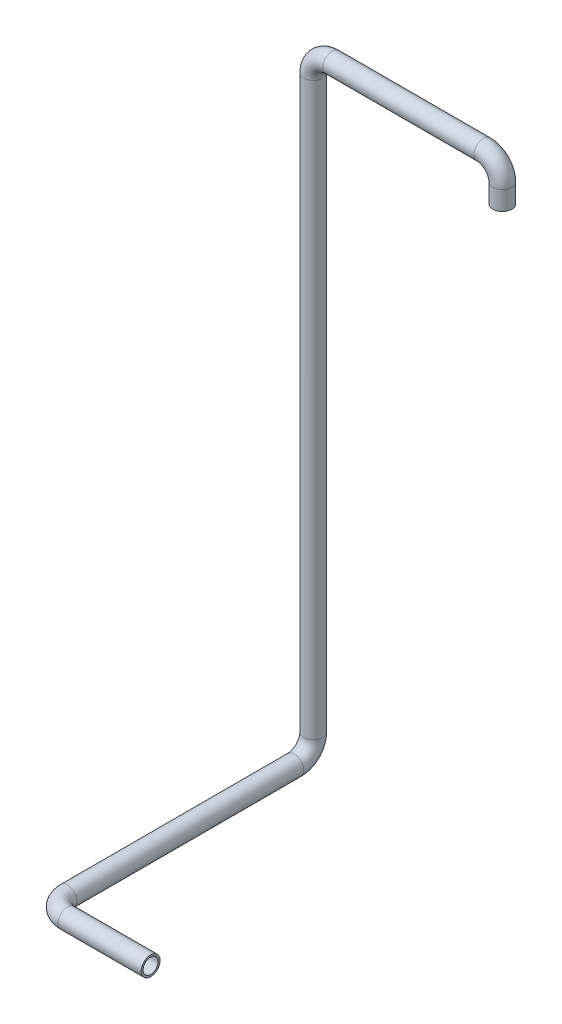
ISO-10303-21;
HEADER;
FILE_DESCRIPTION(('STEP AP214'),'2;1');
FILE_NAME('part.step','',(''),(''),'','','');
FILE_SCHEMA(('AUTOMOTIVE_DESIGN { 1 0 10303 214 1 1 1 1 }'));
ENDSEC;
DATA;
#1=APPLICATION_CONTEXT('core data for automotive mechanical design processes');
#2=APPLICATION_PROTOCOL_DEFINITION('international standard','automotive_design',2000,#1);
#3=PRODUCT_CONTEXT('',#1,'mechanical');
#4=PRODUCT('Part','Part','',(#3));
#5=PRODUCT_RELATED_PRODUCT_CATEGORY('part','',(#4));
#6=PRODUCT_DEFINITION_FORMATION('','',#4);
#7=PRODUCT_DEFINITION_CONTEXT('part definition',#1,'design');
#8=PRODUCT_DEFINITION('design','',#6,#7);
#9=PRODUCT_DEFINITION_SHAPE('','',#8);
#10=(LENGTH_UNIT() NAMED_UNIT(*) SI_UNIT(.MILLI.,.METRE.));
#11=(NAMED_UNIT(*) PLANE_ANGLE_UNIT() SI_UNIT($,.RADIAN.));
#12=(NAMED_UNIT(*) SI_UNIT($,.STERADIAN.) SOLID_ANGLE_UNIT());
#13=UNCERTAINTY_MEASURE_WITH_UNIT(LENGTH_MEASURE(1.E-05),#10,'distance_accuracy_value','');
#14=(GEOMETRIC_REPRESENTATION_CONTEXT(3) GLOBAL_UNCERTAINTY_ASSIGNED_CONTEXT((#13)) GLOBAL_UNIT_ASSIGNED_CONTEXT((#10,
#11,#12)) REPRESENTATION_CONTEXT('',''));
#15=CARTESIAN_POINT('',(0.,0.,0.));
#16=DIRECTION('',(0.,0.,1.));
#17=DIRECTION('',(1.,0.,0.));
#18=AXIS2_PLACEMENT_3D('',#15,#16,#17);
#19=CARTESIAN_POINT('',(0.,0.,0.));
#20=DIRECTION('',(0.,-1.,0.));
#21=DIRECTION('',(1.,0.,0.));
#22=AXIS2_PLACEMENT_3D('',#19,#20,#21);
#23=PLANE('',#22);
#24=CARTESIAN_POINT('',(0.,0.,0.));
#25=DIRECTION('',(0.,-1.,0.));
#26=DIRECTION('',(1.,0.,0.));
#27=AXIS2_PLACEMENT_3D('',#24,#25,#26);
#28=CIRCLE('',#27,4.);
#29=CARTESIAN_POINT('',(4.,0.,0.));
#30=VERTEX_POINT('',#29);
#31=EDGE_CURVE('E98',#30,#30,#28,.T.);
#32=ORIENTED_EDGE('',*,*,#31,.F.);
#33=EDGE_LOOP('',(#32));
#34=FACE_BOUND('',#33,.T.);
#35=CARTESIAN_POINT('',(0.,0.,0.));
#36=DIRECTION('',(0.,-1.,0.));
#37=DIRECTION('',(1.,0.,0.));
#38=AXIS2_PLACEMENT_3D('',#35,#36,#37);
#39=CIRCLE('',#38,5.);
#40=CARTESIAN_POINT('',(5.,0.,0.));
#41=VERTEX_POINT('',#40);
#42=EDGE_CURVE('E94',#41,#41,#39,.T.);
#43=ORIENTED_EDGE('',*,*,#42,.T.);
#44=EDGE_LOOP('',(#43));
#45=FACE_BOUND('',#44,.T.);
#46=ADVANCED_FACE('F75',(#34,#45),#23,.T.);
#47=CARTESIAN_POINT('',(0.,0.,0.));
#48=DIRECTION('',(0.,1.,0.));
#49=DIRECTION('',(0.,0.,1.));
#50=AXIS2_PLACEMENT_3D('',#47,#48,#49);
#51=CYLINDRICAL_SURFACE('',#50,5.);
#52=CARTESIAN_POINT('',(0.,9.99999999999995,0.));
#53=DIRECTION('',(0.,-1.,0.));
#54=DIRECTION('',(1.,0.,0.));
#55=AXIS2_PLACEMENT_3D('',#52,#53,#54);
#56=CIRCLE('',#55,5.);
#57=CARTESIAN_POINT('',(5.,9.99999999999993,0.));
#58=VERTEX_POINT('',#57);
#59=EDGE_CURVE('E89',#58,#58,#56,.T.);
#60=ORIENTED_EDGE('',*,*,#59,.T.);
#61=EDGE_LOOP('',(#60));
#62=FACE_BOUND('',#61,.T.);
#63=ORIENTED_EDGE('',*,*,#42,.F.);
#64=EDGE_LOOP('',(#63));
#65=FACE_BOUND('',#64,.T.);
#66=ADVANCED_FACE('F189',(#62,#65),#51,.T.);
#67=CARTESIAN_POINT('',(-10.,10.,0.));
#68=DIRECTION('',(0.,0.,1.));
#69=DIRECTION('',(1.,0.,0.));
#70=AXIS2_PLACEMENT_3D('',#67,#68,#69);
#71=TOROIDAL_SURFACE('',#70,10.,5.);
#72=CARTESIAN_POINT('',(-10.0000000000001,20.,0.));
#73=DIRECTION('',(1.,0.,0.));
#74=DIRECTION('',(0.,1.,0.));
#75=AXIS2_PLACEMENT_3D('',#72,#73,#74);
#76=CIRCLE('',#75,5.);
#77=CARTESIAN_POINT('',(-10.0000000000001,25.,0.));
#78=VERTEX_POINT('',#77);
#79=EDGE_CURVE('E85',#78,#78,#76,.T.);
#80=CARTESIAN_POINT('',(-10.,10.,0.));
#81=DIRECTION('',(0.,0.,1.));
#82=DIRECTION('',(1.,0.,0.));
#83=AXIS2_PLACEMENT_3D('',#80,#81,#82);
#84=CIRCLE('',#83,15.);
#85=EDGE_CURVE('',#58,#78,#84,.T.);
#86=ORIENTED_EDGE('',*,*,#59,.F.);
#87=ORIENTED_EDGE('',*,*,#79,.T.);
#88=ORIENTED_EDGE('',*,*,#85,.T.);
#89=ORIENTED_EDGE('',*,*,#85,.F.);
#90=EDGE_LOOP('',(#86,#88,#87,#89));
#91=FACE_BOUND('',#90,.T.);
#92=ADVANCED_FACE('F186',(#91),#71,.T.);
#93=CARTESIAN_POINT('',(-10.0000000000001,20.,0.));
#94=DIRECTION('',(-1.,0.,0.));
#95=DIRECTION('',(0.,-1.,0.));
#96=AXIS2_PLACEMENT_3D('',#93,#94,#95);
#97=CYLINDRICAL_SURFACE('',#96,5.);
#98=CARTESIAN_POINT('',(-90.,20.,0.));
#99=DIRECTION('',(1.,0.,0.));
#100=DIRECTION('',(0.,1.,0.));
#101=AXIS2_PLACEMENT_3D('',#98,#99,#100);
#102=CIRCLE('',#101,5.);
#103=CARTESIAN_POINT('',(-90.,25.,0.));
#104=VERTEX_POINT('',#103);
#105=EDGE_CURVE('E81',#104,#104,#102,.T.);
#106=ORIENTED_EDGE('',*,*,#105,.T.);
#107=EDGE_LOOP('',(#106));
#108=FACE_BOUND('',#107,.T.);
#109=ORIENTED_EDGE('',*,*,#79,.F.);
#110=EDGE_LOOP('',(#109));
#111=FACE_BOUND('',#110,.T.);
#112=ADVANCED_FACE('F180',(#108,#111),#97,.T.);
#113=CARTESIAN_POINT('',(-90.,9.99999999999999,0.));
#114=DIRECTION('',(0.,0.,1.));
#115=DIRECTION('',(1.,0.,0.));
#116=AXIS2_PLACEMENT_3D('',#113,#114,#115);
#117=TOROIDAL_SURFACE('',#116,10.,5.);
#118=CARTESIAN_POINT('',(-99.9999999999999,10.,0.));
#119=DIRECTION('',(0.,1.,0.));
#120=DIRECTION('',(-1.,0.,0.));
#121=AXIS2_PLACEMENT_3D('',#118,#119,#120);
#122=CIRCLE('',#121,5.);
#123=CARTESIAN_POINT('',(-105.,10.,0.));
#124=VERTEX_POINT('',#123);
#125=EDGE_CURVE('E11',#124,#124,#122,.T.);
#126=CARTESIAN_POINT('',(-90.,9.99999999999999,0.));
#127=DIRECTION('',(0.,0.,1.));
#128=DIRECTION('',(1.,0.,0.));
#129=AXIS2_PLACEMENT_3D('',#126,#127,#128);
#130=CIRCLE('',#129,15.);
#131=EDGE_CURVE('',#104,#124,#130,.T.);
#132=ORIENTED_EDGE('',*,*,#105,.F.);
#133=ORIENTED_EDGE('',*,*,#125,.T.);
#134=ORIENTED_EDGE('',*,*,#131,.T.);
#135=ORIENTED_EDGE('',*,*,#131,.F.);
#136=EDGE_LOOP('',(#132,#134,#133,#135));
#137=FACE_BOUND('',#136,.T.);
#138=ADVANCED_FACE('F171',(#137),#117,.T.);
#139=CARTESIAN_POINT('',(-100.,10.,0.));
#140=DIRECTION('',(0.,-1.,0.));
#141=DIRECTION('',(1.,0.,0.));
#142=AXIS2_PLACEMENT_3D('',#139,#140,#141);
#143=CYLINDRICAL_SURFACE('',#142,5.);
#144=ORIENTED_EDGE('',*,*,#125,.F.);
#145=EDGE_LOOP('',(#144));
#146=FACE_BOUND('',#145,.T.);
#147=CARTESIAN_POINT('',(-100.,-292.,0.));
#148=DIRECTION('',(0.,1.,0.));
#149=DIRECTION('',(0.,0.,1.));
#150=AXIS2_PLACEMENT_3D('',#147,#148,#149);
#151=CIRCLE('',#150,5.);
#152=CARTESIAN_POINT('',(-100.,-292.,-4.99999999999995));
#153=VERTEX_POINT('',#152);
#154=EDGE_CURVE('E115',#153,#153,#151,.T.);
#155=ORIENTED_EDGE('',*,*,#154,.T.);
#156=EDGE_LOOP('',(#155));
#157=FACE_BOUND('',#156,.T.);
#158=ADVANCED_FACE('F168',(#146,#157),#143,.T.);
#159=CARTESIAN_POINT('',(0.,0.,0.));
#160=DIRECTION('',(0.,1.,0.));
#161=DIRECTION('',(0.,0.,1.));
#162=AXIS2_PLACEMENT_3D('',#159,#160,#161);
#163=CYLINDRICAL_SURFACE('',#162,4.);
#164=CARTESIAN_POINT('',(0.,9.99999999999995,0.));
#165=DIRECTION('',(0.,1.,0.));
#166=DIRECTION('',(0.,0.,1.));
#167=AXIS2_PLACEMENT_3D('',#164,#165,#166);
#168=CIRCLE('',#167,4.);
#169=CARTESIAN_POINT('',(4.,9.99999999999993,0.));
#170=VERTEX_POINT('',#169);
#171=EDGE_CURVE('E101',#170,#170,#168,.F.);
#172=ORIENTED_EDGE('',*,*,#171,.F.);
#173=EDGE_LOOP('',(#172));
#174=FACE_BOUND('',#173,.T.);
#175=ORIENTED_EDGE('',*,*,#31,.T.);
#176=EDGE_LOOP('',(#175));
#177=FACE_BOUND('',#176,.T.);
#178=ADVANCED_FACE('F170',(#174,#177),#163,.F.);
#179=CARTESIAN_POINT('',(-10.,10.,0.));
#180=DIRECTION('',(0.,0.,1.));
#181=DIRECTION('',(1.,0.,0.));
#182=AXIS2_PLACEMENT_3D('',#179,#180,#181);
#183=TOROIDAL_SURFACE('',#182,10.,4.);
#184=CARTESIAN_POINT('',(-10.0000000000001,20.,0.));
#185=DIRECTION('',(1.,0.,0.));
#186=DIRECTION('',(0.,1.,0.));
#187=AXIS2_PLACEMENT_3D('',#184,#185,#186);
#188=CIRCLE('',#187,4.);
#189=CARTESIAN_POINT('',(-10.0000000000001,24.,0.));
#190=VERTEX_POINT('',#189);
#191=EDGE_CURVE('E108',#190,#190,#188,.T.);
#192=CARTESIAN_POINT('',(-10.,10.,0.));
#193=DIRECTION('',(0.,0.,1.));
#194=DIRECTION('',(1.,0.,0.));
#195=AXIS2_PLACEMENT_3D('',#192,#193,#194);
#196=CIRCLE('',#195,14.);
#197=EDGE_CURVE('',#170,#190,#196,.T.);
#198=ORIENTED_EDGE('',*,*,#171,.T.);
#199=ORIENTED_EDGE('',*,*,#191,.F.);
#200=ORIENTED_EDGE('',*,*,#197,.T.);
#201=ORIENTED_EDGE('',*,*,#197,.F.);
#202=EDGE_LOOP('',(#198,#200,#199,#201));
#203=FACE_BOUND('',#202,.T.);
#204=ADVANCED_FACE('F177',(#203),#183,.F.);
#205=CARTESIAN_POINT('',(-10.0000000000001,20.,0.));
#206=DIRECTION('',(-1.,0.,0.));
#207=DIRECTION('',(0.,-1.,0.));
#208=AXIS2_PLACEMENT_3D('',#205,#206,#207);
#209=CYLINDRICAL_SURFACE('',#208,4.);
#210=CARTESIAN_POINT('',(-90.,20.,0.));
#211=DIRECTION('',(-1.,0.,0.));
#212=DIRECTION('',(0.,-1.,0.));
#213=AXIS2_PLACEMENT_3D('',#210,#211,#212);
#214=CIRCLE('',#213,4.);
#215=CARTESIAN_POINT('',(-90.,24.,0.));
#216=VERTEX_POINT('',#215);
#217=EDGE_CURVE('E105',#216,#216,#214,.F.);
#218=ORIENTED_EDGE('',*,*,#217,.F.);
#219=EDGE_LOOP('',(#218));
#220=FACE_BOUND('',#219,.T.);
#221=ORIENTED_EDGE('',*,*,#191,.T.);
#222=EDGE_LOOP('',(#221));
#223=FACE_BOUND('',#222,.T.);
#224=ADVANCED_FACE('F200',(#220,#223),#209,.F.);
#225=CARTESIAN_POINT('',(-90.,9.99999999999999,0.));
#226=DIRECTION('',(0.,0.,1.));
#227=DIRECTION('',(1.,0.,0.));
#228=AXIS2_PLACEMENT_3D('',#225,#226,#227);
#229=TOROIDAL_SURFACE('',#228,10.,4.);
#230=CARTESIAN_POINT('',(-100.,10.,0.));
#231=DIRECTION('',(0.,1.,0.));
#232=DIRECTION('',(-1.,0.,0.));
#233=AXIS2_PLACEMENT_3D('',#230,#231,#232);
#234=CIRCLE('',#233,4.);
#235=CARTESIAN_POINT('',(-104.,10.,0.));
#236=VERTEX_POINT('',#235);
#237=EDGE_CURVE('E97',#236,#236,#234,.T.);
#238=CARTESIAN_POINT('',(-90.,9.99999999999999,0.));
#239=DIRECTION('',(0.,0.,1.));
#240=DIRECTION('',(1.,0.,0.));
#241=AXIS2_PLACEMENT_3D('',#238,#239,#240);
#242=CIRCLE('',#241,14.);
#243=EDGE_CURVE('',#216,#236,#242,.T.);
#244=ORIENTED_EDGE('',*,*,#217,.T.);
#245=ORIENTED_EDGE('',*,*,#237,.F.);
#246=ORIENTED_EDGE('',*,*,#243,.T.);
#247=ORIENTED_EDGE('',*,*,#243,.F.);
#248=EDGE_LOOP('',(#244,#246,#245,#247));
#249=FACE_BOUND('',#248,.T.);
#250=ADVANCED_FACE('F196',(#249),#229,.F.);
#251=CARTESIAN_POINT('',(-100.,10.,0.));
#252=DIRECTION('',(0.,-1.,0.));
#253=DIRECTION('',(1.,0.,0.));
#254=AXIS2_PLACEMENT_3D('',#251,#252,#253);
#255=CYLINDRICAL_SURFACE('',#254,4.);
#256=ORIENTED_EDGE('',*,*,#237,.T.);
#257=EDGE_LOOP('',(#256));
#258=FACE_BOUND('',#257,.T.);
#259=CARTESIAN_POINT('',(-100.,-292.,0.));
#260=DIRECTION('',(0.,-1.,0.));
#261=DIRECTION('',(0.,0.,-1.));
#262=AXIS2_PLACEMENT_3D('',#259,#260,#261);
#263=CIRCLE('',#262,4.);
#264=CARTESIAN_POINT('',(-100.,-292.,-3.99999999999995));
#265=VERTEX_POINT('',#264);
#266=EDGE_CURVE('E121',#265,#265,#263,.F.);
#267=ORIENTED_EDGE('',*,*,#266,.F.);
#268=EDGE_LOOP('',(#267));
#269=FACE_BOUND('',#268,.T.);
#270=ADVANCED_FACE('F166',(#258,#269),#255,.F.);
#271=CARTESIAN_POINT('',(-100.,-292.,9.99999999999999));
#272=DIRECTION('',(-1.,0.,0.));
#273=DIRECTION('',(0.,0.,1.));
#274=AXIS2_PLACEMENT_3D('',#271,#272,#273);
#275=TOROIDAL_SURFACE('',#274,9.99999999999993,5.);
#276=CARTESIAN_POINT('',(-100.,-302.000000000001,9.99999999999746));
#277=DIRECTION('',(0.,0.,-1.));
#278=DIRECTION('',(0.,1.,0.));
#279=AXIS2_PLACEMENT_3D('',#276,#277,#278);
#280=CIRCLE('',#279,5.);
#281=CARTESIAN_POINT('',(-100.,-307.,9.99999999999619));
#282=VERTEX_POINT('',#281);
#283=EDGE_CURVE('E102',#282,#282,#280,.T.);
#284=CARTESIAN_POINT('',(-100.,-292.,9.99999999999999));
#285=DIRECTION('',(-1.,0.,0.));
#286=DIRECTION('',(0.,0.,1.));
#287=AXIS2_PLACEMENT_3D('',#284,#285,#286);
#288=CIRCLE('',#287,14.9999999999999);
#289=EDGE_CURVE('',#153,#282,#288,.T.);
#290=ORIENTED_EDGE('',*,*,#154,.F.);
#291=ORIENTED_EDGE('',*,*,#283,.T.);
#292=ORIENTED_EDGE('',*,*,#289,.T.);
#293=ORIENTED_EDGE('',*,*,#289,.F.);
#294=EDGE_LOOP('',(#290,#292,#291,#293));
#295=FACE_BOUND('',#294,.T.);
#296=ADVANCED_FACE('F151',(#295),#275,.T.);
#297=CARTESIAN_POINT('',(-100.,-302.,10.));
#298=DIRECTION('',(0.,0.,1.));
#299=DIRECTION('',(0.,-1.,0.));
#300=AXIS2_PLACEMENT_3D('',#297,#298,#299);
#301=CYLINDRICAL_SURFACE('',#300,5.);
#302=ORIENTED_EDGE('',*,*,#283,.F.);
#303=EDGE_LOOP('',(#302));
#304=FACE_BOUND('',#303,.T.);
#305=CARTESIAN_POINT('',(-100.,-302.,130.));
#306=DIRECTION('',(0.,0.,-1.));
#307=DIRECTION('',(-1.,0.,0.));
#308=AXIS2_PLACEMENT_3D('',#305,#306,#307);
#309=CIRCLE('',#308,5.);
#310=CARTESIAN_POINT('',(-105.,-302.,130.));
#311=VERTEX_POINT('',#310);
#312=EDGE_CURVE('E130',#311,#311,#309,.T.);
#313=ORIENTED_EDGE('',*,*,#312,.T.);
#314=EDGE_LOOP('',(#313));
#315=FACE_BOUND('',#314,.T.);
#316=ADVANCED_FACE('F160',(#304,#315),#301,.T.);
#317=CARTESIAN_POINT('',(-100.,-292.,9.99999999999999));
#318=DIRECTION('',(-1.,0.,0.));
#319=DIRECTION('',(0.,0.,1.));
#320=AXIS2_PLACEMENT_3D('',#317,#318,#319);
#321=TOROIDAL_SURFACE('',#320,9.99999999999993,4.);
#322=CARTESIAN_POINT('',(-100.,-302.,9.99999999999826));
#323=DIRECTION('',(0.,1.72490310441696E-13,-1.));
#324=DIRECTION('',(0.,1.,1.72490310441696E-13));
#325=AXIS2_PLACEMENT_3D('',#322,#323,#324);
#326=CIRCLE('',#325,4.);
#327=CARTESIAN_POINT('',(-100.,-306.,9.99999999999757));
#328=VERTEX_POINT('',#327);
#329=EDGE_CURVE('E118',#328,#328,#326,.T.);
#330=CARTESIAN_POINT('',(-100.,-292.,9.99999999999999));
#331=DIRECTION('',(-1.,0.,0.));
#332=DIRECTION('',(0.,0.,1.));
#333=AXIS2_PLACEMENT_3D('',#330,#331,#332);
#334=CIRCLE('',#333,13.9999999999999);
#335=EDGE_CURVE('',#265,#328,#334,.T.);
#336=ORIENTED_EDGE('',*,*,#266,.T.);
#337=ORIENTED_EDGE('',*,*,#329,.F.);
#338=ORIENTED_EDGE('',*,*,#335,.T.);
#339=ORIENTED_EDGE('',*,*,#335,.F.);
#340=EDGE_LOOP('',(#336,#338,#337,#339));
#341=FACE_BOUND('',#340,.T.);
#342=ADVANCED_FACE('F148',(#341),#321,.F.);
#343=CARTESIAN_POINT('',(-100.,-302.,10.));
#344=DIRECTION('',(0.,0.,1.));
#345=DIRECTION('',(0.,-1.,0.));
#346=AXIS2_PLACEMENT_3D('',#343,#344,#345);
#347=CYLINDRICAL_SURFACE('',#346,4.);
#348=ORIENTED_EDGE('',*,*,#329,.T.);
#349=EDGE_LOOP('',(#348));
#350=FACE_BOUND('',#349,.T.);
#351=CARTESIAN_POINT('',(-100.,-302.,130.));
#352=DIRECTION('',(0.,0.,1.));
#353=DIRECTION('',(1.,0.,0.));
#354=AXIS2_PLACEMENT_3D('',#351,#352,#353);
#355=CIRCLE('',#354,4.);
#356=CARTESIAN_POINT('',(-104.,-302.,130.));
#357=VERTEX_POINT('',#356);
#358=EDGE_CURVE('E139',#357,#357,#355,.F.);
#359=ORIENTED_EDGE('',*,*,#358,.F.);
#360=EDGE_LOOP('',(#359));
#361=FACE_BOUND('',#360,.T.);
#362=ADVANCED_FACE('F145',(#350,#361),#347,.F.);
#363=CARTESIAN_POINT('',(-46.,-302.,140.));
#364=DIRECTION('',(-1.,0.,0.));
#365=DIRECTION('',(0.,0.,1.));
#366=AXIS2_PLACEMENT_3D('',#363,#364,#365);
#367=PLANE('',#366);
#368=CARTESIAN_POINT('',(-46.,-302.,140.));
#369=DIRECTION('',(-1.,0.,0.));
#370=DIRECTION('',(0.,0.,1.));
#371=AXIS2_PLACEMENT_3D('',#368,#369,#370);
#372=CIRCLE('',#371,4.);
#373=CARTESIAN_POINT('',(-46.,-302.,144.));
#374=VERTEX_POINT('',#373);
#375=EDGE_CURVE('E133',#374,#374,#372,.T.);
#376=ORIENTED_EDGE('',*,*,#375,.T.);
#377=EDGE_LOOP('',(#376));
#378=FACE_BOUND('',#377,.T.);
#379=CARTESIAN_POINT('',(-46.,-302.,140.));
#380=DIRECTION('',(-1.,0.,0.));
#381=DIRECTION('',(0.,0.,1.));
#382=AXIS2_PLACEMENT_3D('',#379,#380,#381);
#383=CIRCLE('',#382,5.);
#384=CARTESIAN_POINT('',(-46.,-302.,145.));
#385=VERTEX_POINT('',#384);
#386=EDGE_CURVE('E124',#385,#385,#383,.T.);
#387=ORIENTED_EDGE('',*,*,#386,.F.);
#388=EDGE_LOOP('',(#387));
#389=FACE_BOUND('',#388,.T.);
#390=ADVANCED_FACE('F147',(#378,#389),#367,.F.);
#391=CARTESIAN_POINT('',(-90.,-302.,130.));
#392=DIRECTION('',(0.,1.,0.));
#393=DIRECTION('',(0.,0.,1.));
#394=AXIS2_PLACEMENT_3D('',#391,#392,#393);
#395=TOROIDAL_SURFACE('',#394,9.99999999999999,5.);
#396=CARTESIAN_POINT('',(-90.,-302.,140.));
#397=DIRECTION('',(-1.,0.,0.));
#398=DIRECTION('',(0.,0.,1.));
#399=AXIS2_PLACEMENT_3D('',#396,#397,#398);
#400=CIRCLE('',#399,5.);
#401=CARTESIAN_POINT('',(-90.,-302.,145.));
#402=VERTEX_POINT('',#401);
#403=EDGE_CURVE('E127',#402,#402,#400,.T.);
#404=CARTESIAN_POINT('',(-90.,-302.,130.));
#405=DIRECTION('',(0.,1.,0.));
#406=DIRECTION('',(0.,0.,1.));
#407=AXIS2_PLACEMENT_3D('',#404,#405,#406);
#408=CIRCLE('',#407,15.);
#409=EDGE_CURVE('',#311,#402,#408,.T.);
#410=ORIENTED_EDGE('',*,*,#312,.F.);
#411=ORIENTED_EDGE('',*,*,#403,.T.);
#412=ORIENTED_EDGE('',*,*,#409,.T.);
#413=ORIENTED_EDGE('',*,*,#409,.F.);
#414=EDGE_LOOP('',(#410,#412,#411,#413));
#415=FACE_BOUND('',#414,.T.);
#416=ADVANCED_FACE('F156',(#415),#395,.T.);
#417=CARTESIAN_POINT('',(-90.,-302.,140.));
#418=DIRECTION('',(1.,0.,0.));
#419=DIRECTION('',(0.,0.,-1.));
#420=AXIS2_PLACEMENT_3D('',#417,#418,#419);
#421=CYLINDRICAL_SURFACE('',#420,5.);
#422=ORIENTED_EDGE('',*,*,#386,.T.);
#423=EDGE_LOOP('',(#422));
#424=FACE_BOUND('',#423,.T.);
#425=ORIENTED_EDGE('',*,*,#403,.F.);
#426=EDGE_LOOP('',(#425));
#427=FACE_BOUND('',#426,.T.);
#428=ADVANCED_FACE('F163',(#424,#427),#421,.T.);
#429=CARTESIAN_POINT('',(-90.,-302.,130.));
#430=DIRECTION('',(0.,1.,0.));
#431=DIRECTION('',(0.,0.,1.));
#432=AXIS2_PLACEMENT_3D('',#429,#430,#431);
#433=TOROIDAL_SURFACE('',#432,9.99999999999999,4.);
#434=CARTESIAN_POINT('',(-90.,-302.,140.));
#435=DIRECTION('',(-1.,0.,0.));
#436=DIRECTION('',(0.,0.,1.));
#437=AXIS2_PLACEMENT_3D('',#434,#435,#436);
#438=CIRCLE('',#437,4.);
#439=CARTESIAN_POINT('',(-90.,-302.,144.));
#440=VERTEX_POINT('',#439);
#441=EDGE_CURVE('E136',#440,#440,#438,.T.);
#442=CARTESIAN_POINT('',(-90.,-302.,130.));
#443=DIRECTION('',(0.,1.,0.));
#444=DIRECTION('',(0.,0.,1.));
#445=AXIS2_PLACEMENT_3D('',#442,#443,#444);
#446=CIRCLE('',#445,14.);
#447=EDGE_CURVE('',#357,#440,#446,.T.);
#448=ORIENTED_EDGE('',*,*,#358,.T.);
#449=ORIENTED_EDGE('',*,*,#441,.F.);
#450=ORIENTED_EDGE('',*,*,#447,.T.);
#451=ORIENTED_EDGE('',*,*,#447,.F.);
#452=EDGE_LOOP('',(#448,#450,#449,#451));
#453=FACE_BOUND('',#452,.T.);
#454=ADVANCED_FACE('F143',(#453),#433,.F.);
#455=CARTESIAN_POINT('',(-90.,-302.,140.));
#456=DIRECTION('',(1.,0.,0.));
#457=DIRECTION('',(0.,0.,-1.));
#458=AXIS2_PLACEMENT_3D('',#455,#456,#457);
#459=CYLINDRICAL_SURFACE('',#458,4.);
#460=ORIENTED_EDGE('',*,*,#375,.F.);
#461=EDGE_LOOP('',(#460));
#462=FACE_BOUND('',#461,.T.);
#463=ORIENTED_EDGE('',*,*,#441,.T.);
#464=EDGE_LOOP('',(#463));
#465=FACE_BOUND('',#464,.T.);
#466=ADVANCED_FACE('F159',(#462,#465),#459,.F.);
#467=CLOSED_SHELL('',(#46,#66,#92,#112,#138,#158,#178,#204,#224,#250,#270,#296,#316,#342,#362,
#390,#416,#428,#454,#466));
#468=MANIFOLD_SOLID_BREP('B2',#467);
#469=ADVANCED_BREP_SHAPE_REPRESENTATION('',(#18,#468),#14);
#470=SHAPE_DEFINITION_REPRESENTATION(#9,#469);
ENDSEC;
END-ISO-10303-21;
